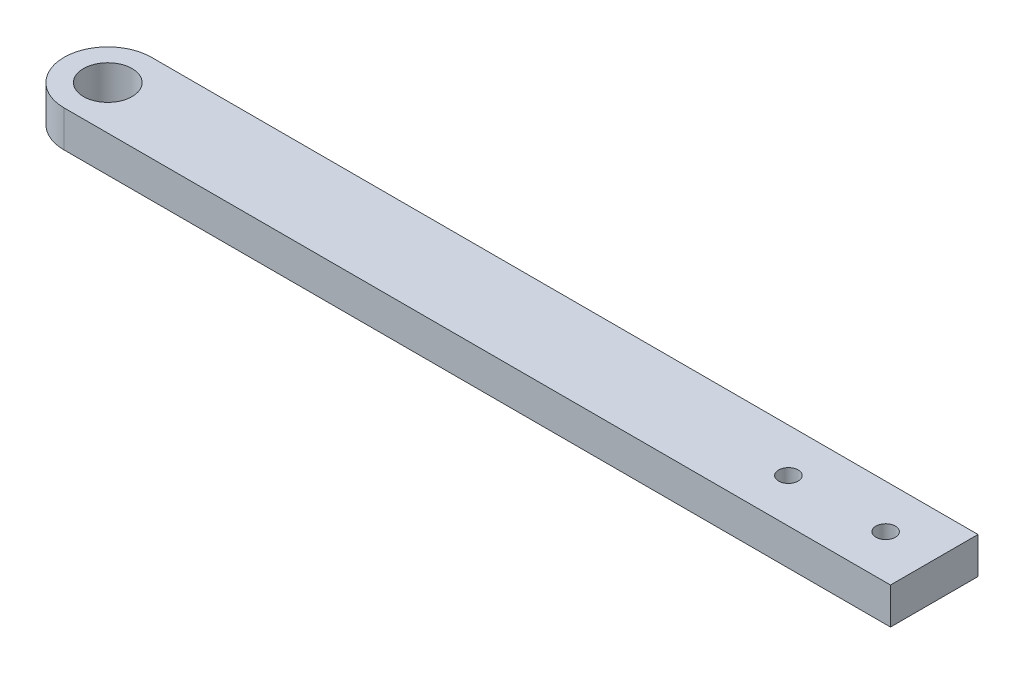
ISO-10303-21;
HEADER;
FILE_DESCRIPTION(('STEP AP214'),'2;1');
FILE_NAME('part.step','',(''),(''),'','','');
FILE_SCHEMA(('AUTOMOTIVE_DESIGN { 1 0 10303 214 1 1 1 1 }'));
ENDSEC;
DATA;
#1=APPLICATION_CONTEXT('core data for automotive mechanical design processes');
#2=APPLICATION_PROTOCOL_DEFINITION('international standard','automotive_design',2000,#1);
#3=PRODUCT_CONTEXT('',#1,'mechanical');
#4=PRODUCT('Part','Part','',(#3));
#5=PRODUCT_RELATED_PRODUCT_CATEGORY('part','',(#4));
#6=PRODUCT_DEFINITION_FORMATION('','',#4);
#7=PRODUCT_DEFINITION_CONTEXT('part definition',#1,'design');
#8=PRODUCT_DEFINITION('design','',#6,#7);
#9=PRODUCT_DEFINITION_SHAPE('','',#8);
#10=(LENGTH_UNIT() NAMED_UNIT(*) SI_UNIT(.MILLI.,.METRE.));
#11=(NAMED_UNIT(*) PLANE_ANGLE_UNIT() SI_UNIT($,.RADIAN.));
#12=(NAMED_UNIT(*) SI_UNIT($,.STERADIAN.) SOLID_ANGLE_UNIT());
#13=UNCERTAINTY_MEASURE_WITH_UNIT(LENGTH_MEASURE(1.E-05),#10,'distance_accuracy_value','');
#14=(GEOMETRIC_REPRESENTATION_CONTEXT(3) GLOBAL_UNCERTAINTY_ASSIGNED_CONTEXT((#13)) GLOBAL_UNIT_ASSIGNED_CONTEXT((#10,
#11,#12)) REPRESENTATION_CONTEXT('',''));
#15=CARTESIAN_POINT('',(0.,0.,0.));
#16=DIRECTION('',(0.,0.,1.));
#17=DIRECTION('',(1.,0.,0.));
#18=AXIS2_PLACEMENT_3D('',#15,#16,#17);
#19=CARTESIAN_POINT('',(170.,7.5,-9.));
#20=DIRECTION('',(-1.,0.,0.));
#21=DIRECTION('',(0.,0.,1.));
#22=AXIS2_PLACEMENT_3D('',#19,#20,#21);
#23=PLANE('',#22);
#24=DIRECTION('',(0.,0.,-1.));
#25=VECTOR('',#24,1.);
#26=CARTESIAN_POINT('',(170.,0.,-9.));
#27=LINE('',#26,#25);
#28=CARTESIAN_POINT('',(170.,0.,9.));
#29=VERTEX_POINT('',#28);
#30=CARTESIAN_POINT('',(170.,0.,-9.));
#31=VERTEX_POINT('',#30);
#32=EDGE_CURVE('E113',#29,#31,#27,.T.);
#33=ORIENTED_EDGE('',*,*,#32,.T.);
#34=DIRECTION('',(0.,-1.,0.));
#35=VECTOR('',#34,1.);
#36=CARTESIAN_POINT('',(170.,7.5,-9.));
#37=LINE('',#36,#35);
#38=CARTESIAN_POINT('',(170.,7.5,-9.));
#39=VERTEX_POINT('',#38);
#40=EDGE_CURVE('E11',#39,#31,#37,.T.);
#41=ORIENTED_EDGE('',*,*,#40,.F.);
#42=DIRECTION('',(0.,0.,-1.));
#43=VECTOR('',#42,1.);
#44=CARTESIAN_POINT('',(170.,7.5,-9.));
#45=LINE('',#44,#43);
#46=CARTESIAN_POINT('',(170.,7.5,9.));
#47=VERTEX_POINT('',#46);
#48=EDGE_CURVE('E97',#47,#39,#45,.T.);
#49=ORIENTED_EDGE('',*,*,#48,.F.);
#50=DIRECTION('',(0.,-1.,0.));
#51=VECTOR('',#50,1.);
#52=CARTESIAN_POINT('',(170.,7.5,9.));
#53=LINE('',#52,#51);
#54=EDGE_CURVE('E109',#47,#29,#53,.T.);
#55=ORIENTED_EDGE('',*,*,#54,.T.);
#56=EDGE_LOOP('',(#33,#41,#49,#55));
#57=FACE_BOUND('',#56,.T.);
#58=ADVANCED_FACE('F45',(#57),#23,.F.);
#59=CARTESIAN_POINT('',(0.,7.5,-9.));
#60=DIRECTION('',(0.,0.,1.));
#61=DIRECTION('',(1.,0.,0.));
#62=AXIS2_PLACEMENT_3D('',#59,#60,#61);
#63=PLANE('',#62);
#64=DIRECTION('',(-1.,0.,0.));
#65=VECTOR('',#64,1.);
#66=CARTESIAN_POINT('',(0.,0.,-9.));
#67=LINE('',#66,#65);
#68=CARTESIAN_POINT('',(0.,0.,-9.));
#69=VERTEX_POINT('',#68);
#70=EDGE_CURVE('E102',#31,#69,#67,.T.);
#71=ORIENTED_EDGE('',*,*,#70,.T.);
#72=DIRECTION('',(0.,-1.,0.));
#73=VECTOR('',#72,1.);
#74=CARTESIAN_POINT('',(0.,7.5,-9.));
#75=LINE('',#74,#73);
#76=CARTESIAN_POINT('',(0.,7.5,-9.));
#77=VERTEX_POINT('',#76);
#78=EDGE_CURVE('E54',#77,#69,#75,.T.);
#79=ORIENTED_EDGE('',*,*,#78,.F.);
#80=DIRECTION('',(-1.,0.,0.));
#81=VECTOR('',#80,1.);
#82=CARTESIAN_POINT('',(0.,7.5,-9.));
#83=LINE('',#82,#81);
#84=EDGE_CURVE('E92',#39,#77,#83,.T.);
#85=ORIENTED_EDGE('',*,*,#84,.F.);
#86=ORIENTED_EDGE('',*,*,#40,.T.);
#87=EDGE_LOOP('',(#71,#79,#85,#86));
#88=FACE_BOUND('',#87,.T.);
#89=ADVANCED_FACE('F101',(#88),#63,.F.);
#90=CARTESIAN_POINT('',(0.,7.5,0.));
#91=DIRECTION('',(0.,-1.,0.));
#92=DIRECTION('',(0.,0.,-1.));
#93=AXIS2_PLACEMENT_3D('',#90,#91,#92);
#94=CYLINDRICAL_SURFACE('',#93,9.);
#95=CARTESIAN_POINT('',(0.,0.,0.));
#96=DIRECTION('',(0.,1.,0.));
#97=DIRECTION('',(0.,0.,1.));
#98=AXIS2_PLACEMENT_3D('',#95,#96,#97);
#99=CIRCLE('',#98,9.);
#100=CARTESIAN_POINT('',(0.,0.,9.));
#101=VERTEX_POINT('',#100);
#102=EDGE_CURVE('E79',#69,#101,#99,.T.);
#103=ORIENTED_EDGE('',*,*,#102,.T.);
#104=DIRECTION('',(0.,-1.,0.));
#105=VECTOR('',#104,1.);
#106=CARTESIAN_POINT('',(0.,7.5,9.));
#107=LINE('',#106,#105);
#108=CARTESIAN_POINT('',(0.,7.5,9.));
#109=VERTEX_POINT('',#108);
#110=EDGE_CURVE('E104',#109,#101,#107,.T.);
#111=ORIENTED_EDGE('',*,*,#110,.F.);
#112=CARTESIAN_POINT('',(0.,7.5,0.));
#113=DIRECTION('',(0.,1.,0.));
#114=DIRECTION('',(0.,0.,1.));
#115=AXIS2_PLACEMENT_3D('',#112,#113,#114);
#116=CIRCLE('',#115,9.);
#117=EDGE_CURVE('E95',#77,#109,#116,.T.);
#118=ORIENTED_EDGE('',*,*,#117,.F.);
#119=ORIENTED_EDGE('',*,*,#78,.T.);
#120=EDGE_LOOP('',(#103,#111,#118,#119));
#121=FACE_BOUND('',#120,.T.);
#122=ADVANCED_FACE('F105',(#121),#94,.T.);
#123=CARTESIAN_POINT('',(170.,7.5,9.));
#124=DIRECTION('',(0.,0.,-1.));
#125=DIRECTION('',(-1.,0.,0.));
#126=AXIS2_PLACEMENT_3D('',#123,#124,#125);
#127=PLANE('',#126);
#128=DIRECTION('',(1.,0.,0.));
#129=VECTOR('',#128,1.);
#130=CARTESIAN_POINT('',(170.,0.,9.));
#131=LINE('',#130,#129);
#132=EDGE_CURVE('E85',#101,#29,#131,.T.);
#133=ORIENTED_EDGE('',*,*,#132,.T.);
#134=ORIENTED_EDGE('',*,*,#54,.F.);
#135=DIRECTION('',(1.,0.,0.));
#136=VECTOR('',#135,1.);
#137=CARTESIAN_POINT('',(170.,7.5,9.));
#138=LINE('',#137,#136);
#139=EDGE_CURVE('E62',#109,#47,#138,.T.);
#140=ORIENTED_EDGE('',*,*,#139,.F.);
#141=ORIENTED_EDGE('',*,*,#110,.T.);
#142=EDGE_LOOP('',(#133,#134,#140,#141));
#143=FACE_BOUND('',#142,.T.);
#144=ADVANCED_FACE('F127',(#143),#127,.F.);
#145=CARTESIAN_POINT('',(0.,7.5,0.));
#146=DIRECTION('',(0.,1.,0.));
#147=DIRECTION('',(0.,0.,1.));
#148=AXIS2_PLACEMENT_3D('',#145,#146,#147);
#149=PLANE('',#148);
#150=CARTESIAN_POINT('',(0.,7.5,0.));
#151=DIRECTION('',(0.,1.,0.));
#152=DIRECTION('',(0.,0.,1.));
#153=AXIS2_PLACEMENT_3D('',#150,#151,#152);
#154=CIRCLE('',#153,5.);
#155=CARTESIAN_POINT('',(0.,7.5,5.));
#156=VERTEX_POINT('',#155);
#157=EDGE_CURVE('E150',#156,#156,#154,.T.);
#158=ORIENTED_EDGE('',*,*,#157,.F.);
#159=EDGE_LOOP('',(#158));
#160=FACE_BOUND('',#159,.T.);
#161=CARTESIAN_POINT('',(160.,7.5,0.));
#162=DIRECTION('',(0.,1.,0.));
#163=DIRECTION('',(0.,0.,1.));
#164=AXIS2_PLACEMENT_3D('',#161,#162,#163);
#165=CIRCLE('',#164,2.);
#166=CARTESIAN_POINT('',(160.,7.5,2.));
#167=VERTEX_POINT('',#166);
#168=EDGE_CURVE('E146',#167,#167,#165,.T.);
#169=ORIENTED_EDGE('',*,*,#168,.F.);
#170=EDGE_LOOP('',(#169));
#171=FACE_BOUND('',#170,.T.);
#172=CARTESIAN_POINT('',(140.,7.5,0.));
#173=DIRECTION('',(0.,1.,0.));
#174=DIRECTION('',(0.,0.,1.));
#175=AXIS2_PLACEMENT_3D('',#172,#173,#174);
#176=CIRCLE('',#175,2.);
#177=CARTESIAN_POINT('',(140.,7.5,2.));
#178=VERTEX_POINT('',#177);
#179=EDGE_CURVE('E138',#178,#178,#176,.T.);
#180=ORIENTED_EDGE('',*,*,#179,.F.);
#181=EDGE_LOOP('',(#180));
#182=FACE_BOUND('',#181,.T.);
#183=ORIENTED_EDGE('',*,*,#48,.T.);
#184=ORIENTED_EDGE('',*,*,#84,.T.);
#185=ORIENTED_EDGE('',*,*,#117,.T.);
#186=ORIENTED_EDGE('',*,*,#139,.T.);
#187=EDGE_LOOP('',(#183,#184,#185,#186));
#188=FACE_BOUND('',#187,.T.);
#189=ADVANCED_FACE('F93',(#160,#171,#182,#188),#149,.T.);
#190=CARTESIAN_POINT('',(0.,0.,0.));
#191=DIRECTION('',(0.,1.,0.));
#192=DIRECTION('',(0.,0.,1.));
#193=AXIS2_PLACEMENT_3D('',#190,#191,#192);
#194=PLANE('',#193);
#195=CARTESIAN_POINT('',(0.,0.,0.));
#196=DIRECTION('',(0.,1.,0.));
#197=DIRECTION('',(0.,0.,1.));
#198=AXIS2_PLACEMENT_3D('',#195,#196,#197);
#199=CIRCLE('',#198,5.);
#200=CARTESIAN_POINT('',(0.,0.,5.));
#201=VERTEX_POINT('',#200);
#202=EDGE_CURVE('E117',#201,#201,#199,.T.);
#203=ORIENTED_EDGE('',*,*,#202,.T.);
#204=EDGE_LOOP('',(#203));
#205=FACE_BOUND('',#204,.T.);
#206=CARTESIAN_POINT('',(160.,0.,0.));
#207=DIRECTION('',(0.,1.,0.));
#208=DIRECTION('',(0.,0.,1.));
#209=AXIS2_PLACEMENT_3D('',#206,#207,#208);
#210=CIRCLE('',#209,2.);
#211=CARTESIAN_POINT('',(160.,0.,2.));
#212=VERTEX_POINT('',#211);
#213=EDGE_CURVE('E142',#212,#212,#210,.T.);
#214=ORIENTED_EDGE('',*,*,#213,.T.);
#215=EDGE_LOOP('',(#214));
#216=FACE_BOUND('',#215,.T.);
#217=CARTESIAN_POINT('',(140.,0.,0.));
#218=DIRECTION('',(0.,1.,0.));
#219=DIRECTION('',(0.,0.,1.));
#220=AXIS2_PLACEMENT_3D('',#217,#218,#219);
#221=CIRCLE('',#220,2.);
#222=CARTESIAN_POINT('',(140.,0.,2.));
#223=VERTEX_POINT('',#222);
#224=EDGE_CURVE('E134',#223,#223,#221,.T.);
#225=ORIENTED_EDGE('',*,*,#224,.T.);
#226=EDGE_LOOP('',(#225));
#227=FACE_BOUND('',#226,.T.);
#228=ORIENTED_EDGE('',*,*,#32,.F.);
#229=ORIENTED_EDGE('',*,*,#132,.F.);
#230=ORIENTED_EDGE('',*,*,#102,.F.);
#231=ORIENTED_EDGE('',*,*,#70,.F.);
#232=EDGE_LOOP('',(#228,#229,#230,#231));
#233=FACE_BOUND('',#232,.T.);
#234=ADVANCED_FACE('F130',(#205,#216,#227,#233),#194,.F.);
#235=CARTESIAN_POINT('',(140.,0.,0.));
#236=DIRECTION('',(0.,1.,0.));
#237=DIRECTION('',(0.,0.,1.));
#238=AXIS2_PLACEMENT_3D('',#235,#236,#237);
#239=CYLINDRICAL_SURFACE('',#238,2.);
#240=ORIENTED_EDGE('',*,*,#224,.F.);
#241=EDGE_LOOP('',(#240));
#242=FACE_BOUND('',#241,.T.);
#243=ORIENTED_EDGE('',*,*,#179,.T.);
#244=EDGE_LOOP('',(#243));
#245=FACE_BOUND('',#244,.T.);
#246=ADVANCED_FACE('F174',(#242,#245),#239,.F.);
#247=CARTESIAN_POINT('',(160.,0.,0.));
#248=DIRECTION('',(0.,1.,0.));
#249=DIRECTION('',(0.,0.,1.));
#250=AXIS2_PLACEMENT_3D('',#247,#248,#249);
#251=CYLINDRICAL_SURFACE('',#250,2.);
#252=ORIENTED_EDGE('',*,*,#213,.F.);
#253=EDGE_LOOP('',(#252));
#254=FACE_BOUND('',#253,.T.);
#255=ORIENTED_EDGE('',*,*,#168,.T.);
#256=EDGE_LOOP('',(#255));
#257=FACE_BOUND('',#256,.T.);
#258=ADVANCED_FACE('F163',(#254,#257),#251,.F.);
#259=CARTESIAN_POINT('',(0.,0.,0.));
#260=DIRECTION('',(0.,1.,0.));
#261=DIRECTION('',(0.,0.,1.));
#262=AXIS2_PLACEMENT_3D('',#259,#260,#261);
#263=CYLINDRICAL_SURFACE('',#262,5.);
#264=ORIENTED_EDGE('',*,*,#202,.F.);
#265=EDGE_LOOP('',(#264));
#266=FACE_BOUND('',#265,.T.);
#267=ORIENTED_EDGE('',*,*,#157,.T.);
#268=EDGE_LOOP('',(#267));
#269=FACE_BOUND('',#268,.T.);
#270=ADVANCED_FACE('F160',(#266,#269),#263,.F.);
#271=CLOSED_SHELL('',(#58,#89,#122,#144,#189,#234,#246,#258,#270));
#272=MANIFOLD_SOLID_BREP('B2',#271);
#273=ADVANCED_BREP_SHAPE_REPRESENTATION('',(#18,#272),#14);
#274=SHAPE_DEFINITION_REPRESENTATION(#9,#273);
ENDSEC;
END-ISO-10303-21;
